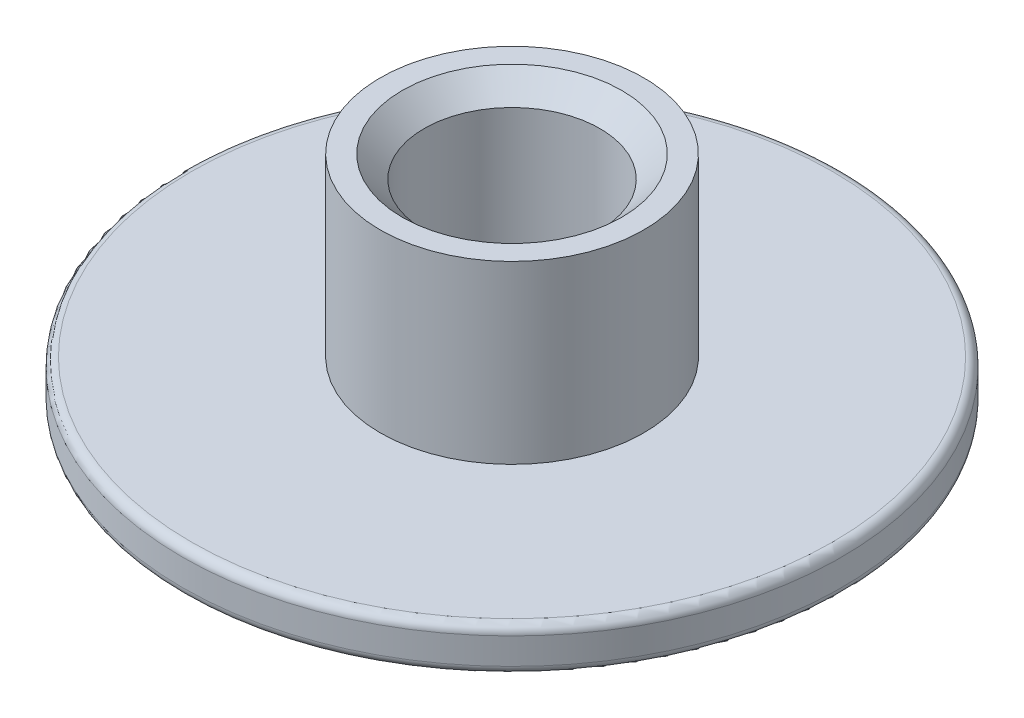
ISO-10303-21;
HEADER;
FILE_DESCRIPTION(('STEP AP214'),'2;1');
FILE_NAME('part.step','',(''),(''),'','','');
FILE_SCHEMA(('AUTOMOTIVE_DESIGN { 1 0 10303 214 1 1 1 1 }'));
ENDSEC;
DATA;
#1=APPLICATION_CONTEXT('core data for automotive mechanical design processes');
#2=APPLICATION_PROTOCOL_DEFINITION('international standard','automotive_design',2000,#1);
#3=PRODUCT_CONTEXT('',#1,'mechanical');
#4=PRODUCT('Part','Part','',(#3));
#5=PRODUCT_RELATED_PRODUCT_CATEGORY('part','',(#4));
#6=PRODUCT_DEFINITION_FORMATION('','',#4);
#7=PRODUCT_DEFINITION_CONTEXT('part definition',#1,'design');
#8=PRODUCT_DEFINITION('design','',#6,#7);
#9=PRODUCT_DEFINITION_SHAPE('','',#8);
#10=(LENGTH_UNIT() NAMED_UNIT(*) SI_UNIT(.MILLI.,.METRE.));
#11=(NAMED_UNIT(*) PLANE_ANGLE_UNIT() SI_UNIT($,.RADIAN.));
#12=(NAMED_UNIT(*) SI_UNIT($,.STERADIAN.) SOLID_ANGLE_UNIT());
#13=UNCERTAINTY_MEASURE_WITH_UNIT(LENGTH_MEASURE(1.E-05),#10,'distance_accuracy_value','');
#14=(GEOMETRIC_REPRESENTATION_CONTEXT(3) GLOBAL_UNCERTAINTY_ASSIGNED_CONTEXT((#13)) GLOBAL_UNIT_ASSIGNED_CONTEXT((#10,
#11,#12)) REPRESENTATION_CONTEXT('',''));
#15=CARTESIAN_POINT('',(0.,0.,0.));
#16=DIRECTION('',(0.,0.,1.));
#17=DIRECTION('',(1.,0.,0.));
#18=AXIS2_PLACEMENT_3D('',#15,#16,#17);
#19=CARTESIAN_POINT('',(0.,1.,0.));
#20=DIRECTION('',(0.,1.,0.));
#21=DIRECTION('',(0.,0.,1.));
#22=AXIS2_PLACEMENT_3D('',#19,#20,#21);
#23=PLANE('',#22);
#24=CARTESIAN_POINT('',(0.,1.,0.));
#25=DIRECTION('',(0.,1.,0.));
#26=DIRECTION('',(0.,0.,1.));
#27=AXIS2_PLACEMENT_3D('',#24,#25,#26);
#28=CIRCLE('',#27,7.3);
#29=CARTESIAN_POINT('',(0.,1.,7.3));
#30=VERTEX_POINT('',#29);
#31=EDGE_CURVE('E10',#30,#30,#28,.T.);
#32=ORIENTED_EDGE('',*,*,#31,.T.);
#33=EDGE_LOOP('',(#32));
#34=FACE_BOUND('',#33,.T.);
#35=CARTESIAN_POINT('',(0.,1.,0.));
#36=DIRECTION('',(0.,1.,0.));
#37=DIRECTION('',(0.,0.,1.));
#38=AXIS2_PLACEMENT_3D('',#35,#36,#37);
#39=CIRCLE('',#38,3.);
#40=CARTESIAN_POINT('',(0.,1.,3.));
#41=VERTEX_POINT('',#40);
#42=EDGE_CURVE('E70',#41,#41,#39,.T.);
#43=ORIENTED_EDGE('',*,*,#42,.F.);
#44=EDGE_LOOP('',(#43));
#45=FACE_BOUND('',#44,.T.);
#46=ADVANCED_FACE('F37',(#34,#45),#23,.T.);
#47=CARTESIAN_POINT('',(0.,1.,0.));
#48=DIRECTION('',(0.,-1.,0.));
#49=DIRECTION('',(0.,0.,-1.));
#50=AXIS2_PLACEMENT_3D('',#47,#48,#49);
#51=CYLINDRICAL_SURFACE('',#50,7.5);
#52=CARTESIAN_POINT('',(0.,0.2,0.));
#53=DIRECTION('',(0.,1.,0.));
#54=DIRECTION('',(0.,0.,1.));
#55=AXIS2_PLACEMENT_3D('',#52,#53,#54);
#56=CIRCLE('',#55,7.5);
#57=CARTESIAN_POINT('',(0.,0.2,7.5));
#58=VERTEX_POINT('',#57);
#59=EDGE_CURVE('E48',#58,#58,#56,.T.);
#60=ORIENTED_EDGE('',*,*,#59,.T.);
#61=EDGE_LOOP('',(#60));
#62=FACE_BOUND('',#61,.T.);
#63=CARTESIAN_POINT('',(0.,0.8,0.));
#64=DIRECTION('',(0.,1.,0.));
#65=DIRECTION('',(0.,0.,1.));
#66=AXIS2_PLACEMENT_3D('',#63,#64,#65);
#67=CIRCLE('',#66,7.5);
#68=CARTESIAN_POINT('',(0.,0.8,7.5));
#69=VERTEX_POINT('',#68);
#70=EDGE_CURVE('E52',#69,#69,#67,.F.);
#71=ORIENTED_EDGE('',*,*,#70,.T.);
#72=EDGE_LOOP('',(#71));
#73=FACE_BOUND('',#72,.T.);
#74=ADVANCED_FACE('F86',(#62,#73),#51,.T.);
#75=CARTESIAN_POINT('',(0.,0.,0.));
#76=DIRECTION('',(0.,1.,0.));
#77=DIRECTION('',(0.,0.,1.));
#78=AXIS2_PLACEMENT_3D('',#75,#76,#77);
#79=PLANE('',#78);
#80=CARTESIAN_POINT('',(0.,0.,0.));
#81=DIRECTION('',(0.,1.,0.));
#82=DIRECTION('',(0.,0.,1.));
#83=AXIS2_PLACEMENT_3D('',#80,#81,#82);
#84=CIRCLE('',#83,7.3);
#85=CARTESIAN_POINT('',(0.,0.,7.3));
#86=VERTEX_POINT('',#85);
#87=EDGE_CURVE('E44',#86,#86,#84,.F.);
#88=ORIENTED_EDGE('',*,*,#87,.T.);
#89=EDGE_LOOP('',(#88));
#90=FACE_BOUND('',#89,.T.);
#91=CARTESIAN_POINT('',(0.,0.,0.));
#92=DIRECTION('',(0.,1.,0.));
#93=DIRECTION('',(0.,0.,1.));
#94=AXIS2_PLACEMENT_3D('',#91,#92,#93);
#95=CIRCLE('',#94,2.5);
#96=CARTESIAN_POINT('',(0.,0.,2.5));
#97=VERTEX_POINT('',#96);
#98=EDGE_CURVE('E60',#97,#97,#95,.T.);
#99=ORIENTED_EDGE('',*,*,#98,.T.);
#100=EDGE_LOOP('',(#99));
#101=FACE_BOUND('',#100,.T.);
#102=ADVANCED_FACE('F81',(#90,#101),#79,.F.);
#103=CARTESIAN_POINT('',(0.,5.,0.));
#104=DIRECTION('',(0.,-1.,0.));
#105=DIRECTION('',(0.,0.,-1.));
#106=AXIS2_PLACEMENT_3D('',#103,#104,#105);
#107=CYLINDRICAL_SURFACE('',#106,3.);
#108=CARTESIAN_POINT('',(0.,5.,0.));
#109=DIRECTION('',(0.,1.,0.));
#110=DIRECTION('',(0.,0.,1.));
#111=AXIS2_PLACEMENT_3D('',#108,#109,#110);
#112=CIRCLE('',#111,3.);
#113=CARTESIAN_POINT('',(0.,5.,3.));
#114=VERTEX_POINT('',#113);
#115=EDGE_CURVE('E69',#114,#114,#112,.T.);
#116=ORIENTED_EDGE('',*,*,#115,.F.);
#117=EDGE_LOOP('',(#116));
#118=FACE_BOUND('',#117,.T.);
#119=ORIENTED_EDGE('',*,*,#42,.T.);
#120=EDGE_LOOP('',(#119));
#121=FACE_BOUND('',#120,.T.);
#122=ADVANCED_FACE('F78',(#118,#121),#107,.T.);
#123=CARTESIAN_POINT('',(0.,5.,0.));
#124=DIRECTION('',(0.,1.,0.));
#125=DIRECTION('',(0.,0.,1.));
#126=AXIS2_PLACEMENT_3D('',#123,#124,#125);
#127=PLANE('',#126);
#128=CARTESIAN_POINT('',(0.,5.,0.));
#129=DIRECTION('',(0.,1.,0.));
#130=DIRECTION('',(0.,0.,1.));
#131=AXIS2_PLACEMENT_3D('',#128,#129,#130);
#132=CIRCLE('',#131,2.5);
#133=CARTESIAN_POINT('',(0.,5.,2.5));
#134=VERTEX_POINT('',#133);
#135=EDGE_CURVE('E57',#134,#134,#132,.F.);
#136=ORIENTED_EDGE('',*,*,#135,.T.);
#137=EDGE_LOOP('',(#136));
#138=FACE_BOUND('',#137,.T.);
#139=ORIENTED_EDGE('',*,*,#115,.T.);
#140=EDGE_LOOP('',(#139));
#141=FACE_BOUND('',#140,.T.);
#142=ADVANCED_FACE('F76',(#138,#141),#127,.T.);
#143=CARTESIAN_POINT('',(0.,-0.00100000000000013,0.));
#144=DIRECTION('',(0.,1.,0.));
#145=DIRECTION('',(0.,0.,1.));
#146=AXIS2_PLACEMENT_3D('',#143,#144,#145);
#147=CYLINDRICAL_SURFACE('',#146,2.);
#148=CARTESIAN_POINT('',(0.,0.5,0.));
#149=DIRECTION('',(0.,1.,0.));
#150=DIRECTION('',(0.,0.,1.));
#151=AXIS2_PLACEMENT_3D('',#148,#149,#150);
#152=CIRCLE('',#151,2.);
#153=CARTESIAN_POINT('',(0.,0.5,2.));
#154=VERTEX_POINT('',#153);
#155=EDGE_CURVE('E63',#154,#154,#152,.F.);
#156=ORIENTED_EDGE('',*,*,#155,.T.);
#157=EDGE_LOOP('',(#156));
#158=FACE_BOUND('',#157,.T.);
#159=CARTESIAN_POINT('',(0.,4.5,0.));
#160=DIRECTION('',(0.,1.,0.));
#161=DIRECTION('',(0.,0.,1.));
#162=AXIS2_PLACEMENT_3D('',#159,#160,#161);
#163=CIRCLE('',#162,2.);
#164=CARTESIAN_POINT('',(0.,4.5,2.));
#165=VERTEX_POINT('',#164);
#166=EDGE_CURVE('E66',#165,#165,#163,.T.);
#167=ORIENTED_EDGE('',*,*,#166,.T.);
#168=EDGE_LOOP('',(#167));
#169=FACE_BOUND('',#168,.T.);
#170=ADVANCED_FACE('F101',(#158,#169),#147,.F.);
#171=CARTESIAN_POINT('',(0.,0.5,0.));
#172=DIRECTION('',(0.,-1.,0.));
#173=DIRECTION('',(0.,0.,-1.));
#174=AXIS2_PLACEMENT_3D('',#171,#172,#173);
#175=CONICAL_SURFACE('',#174,2.,0.785398163397449);
#176=ORIENTED_EDGE('',*,*,#98,.F.);
#177=EDGE_LOOP('',(#176));
#178=FACE_BOUND('',#177,.T.);
#179=ORIENTED_EDGE('',*,*,#155,.F.);
#180=EDGE_LOOP('',(#179));
#181=FACE_BOUND('',#180,.T.);
#182=ADVANCED_FACE('F97',(#178,#181),#175,.F.);
#183=CARTESIAN_POINT('',(0.,4.5,0.));
#184=DIRECTION('',(0.,1.,0.));
#185=DIRECTION('',(0.,0.,1.));
#186=AXIS2_PLACEMENT_3D('',#183,#184,#185);
#187=CONICAL_SURFACE('',#186,2.,0.785398163397448);
#188=ORIENTED_EDGE('',*,*,#135,.F.);
#189=EDGE_LOOP('',(#188));
#190=FACE_BOUND('',#189,.T.);
#191=ORIENTED_EDGE('',*,*,#166,.F.);
#192=EDGE_LOOP('',(#191));
#193=FACE_BOUND('',#192,.T.);
#194=ADVANCED_FACE('F100',(#190,#193),#187,.F.);
#195=CARTESIAN_POINT('',(0.,0.2,0.));
#196=DIRECTION('',(0.,1.,0.));
#197=DIRECTION('',(0.,0.,1.));
#198=AXIS2_PLACEMENT_3D('',#195,#196,#197);
#199=TOROIDAL_SURFACE('',#198,7.3,0.2);
#200=ORIENTED_EDGE('',*,*,#87,.F.);
#201=EDGE_LOOP('',(#200));
#202=FACE_BOUND('',#201,.T.);
#203=ORIENTED_EDGE('',*,*,#59,.F.);
#204=EDGE_LOOP('',(#203));
#205=FACE_BOUND('',#204,.T.);
#206=ADVANCED_FACE('F104',(#202,#205),#199,.T.);
#207=CARTESIAN_POINT('',(0.,0.8,0.));
#208=DIRECTION('',(0.,1.,0.));
#209=DIRECTION('',(0.,0.,1.));
#210=AXIS2_PLACEMENT_3D('',#207,#208,#209);
#211=TOROIDAL_SURFACE('',#210,7.3,0.2);
#212=ORIENTED_EDGE('',*,*,#70,.F.);
#213=EDGE_LOOP('',(#212));
#214=FACE_BOUND('',#213,.T.);
#215=ORIENTED_EDGE('',*,*,#31,.F.);
#216=EDGE_LOOP('',(#215));
#217=FACE_BOUND('',#216,.T.);
#218=ADVANCED_FACE('F39',(#214,#217),#211,.T.);
#219=CLOSED_SHELL('',(#46,#74,#102,#122,#142,#170,#182,#194,#206,#218));
#220=MANIFOLD_SOLID_BREP('B2',#219);
#221=ADVANCED_BREP_SHAPE_REPRESENTATION('',(#18,#220),#14);
#222=SHAPE_DEFINITION_REPRESENTATION(#9,#221);
ENDSEC;
END-ISO-10303-21;
